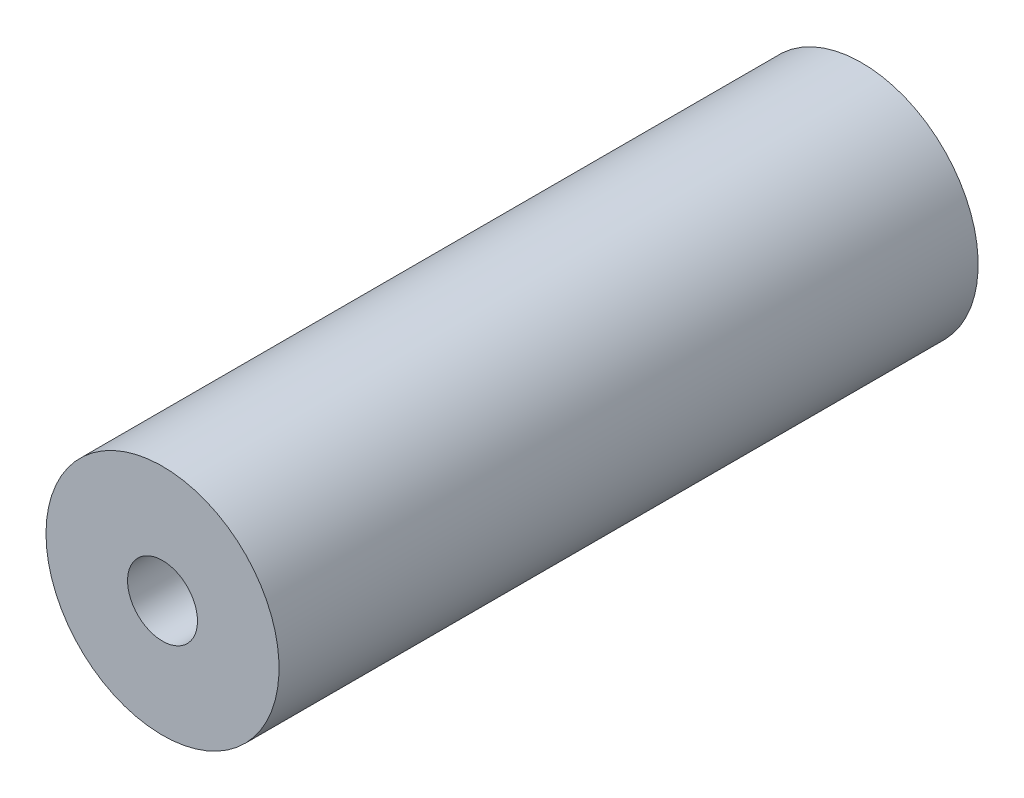
ISO-10303-21;
HEADER;
FILE_DESCRIPTION(('STEP AP214'),'2;1');
FILE_NAME('part.step','',(''),(''),'','','');
FILE_SCHEMA(('AUTOMOTIVE_DESIGN { 1 0 10303 214 1 1 1 1 }'));
ENDSEC;
DATA;
#1=APPLICATION_CONTEXT('core data for automotive mechanical design processes');
#2=APPLICATION_PROTOCOL_DEFINITION('international standard','automotive_design',2000,#1);
#3=PRODUCT_CONTEXT('',#1,'mechanical');
#4=PRODUCT('Part','Part','',(#3));
#5=PRODUCT_RELATED_PRODUCT_CATEGORY('part','',(#4));
#6=PRODUCT_DEFINITION_FORMATION('','',#4);
#7=PRODUCT_DEFINITION_CONTEXT('part definition',#1,'design');
#8=PRODUCT_DEFINITION('design','',#6,#7);
#9=PRODUCT_DEFINITION_SHAPE('','',#8);
#10=(LENGTH_UNIT() NAMED_UNIT(*) SI_UNIT(.MILLI.,.METRE.));
#11=(NAMED_UNIT(*) PLANE_ANGLE_UNIT() SI_UNIT($,.RADIAN.));
#12=(NAMED_UNIT(*) SI_UNIT($,.STERADIAN.) SOLID_ANGLE_UNIT());
#13=UNCERTAINTY_MEASURE_WITH_UNIT(LENGTH_MEASURE(1.E-05),#10,'distance_accuracy_value','');
#14=(GEOMETRIC_REPRESENTATION_CONTEXT(3) GLOBAL_UNCERTAINTY_ASSIGNED_CONTEXT((#13)) GLOBAL_UNIT_ASSIGNED_CONTEXT((#10,
#11,#12)) REPRESENTATION_CONTEXT('',''));
#15=CARTESIAN_POINT('',(0.,0.,0.));
#16=DIRECTION('',(0.,0.,1.));
#17=DIRECTION('',(1.,0.,0.));
#18=AXIS2_PLACEMENT_3D('',#15,#16,#17);
#19=CARTESIAN_POINT('',(0.,0.,21.));
#20=DIRECTION('',(0.,0.,-1.));
#21=DIRECTION('',(-1.,0.,0.));
#22=AXIS2_PLACEMENT_3D('',#19,#20,#21);
#23=CYLINDRICAL_SURFACE('',#22,3.5);
#24=CARTESIAN_POINT('',(0.,0.,21.));
#25=DIRECTION('',(0.,0.,1.));
#26=DIRECTION('',(1.,0.,0.));
#27=AXIS2_PLACEMENT_3D('',#24,#25,#26);
#28=CIRCLE('',#27,3.5);
#29=CARTESIAN_POINT('',(-3.5,0.,21.));
#30=VERTEX_POINT('',#29);
#31=EDGE_CURVE('E11',#30,#30,#28,.T.);
#32=CARTESIAN_POINT('',(0.,0.,0.));
#33=DIRECTION('',(0.,0.,1.));
#34=DIRECTION('',(1.,0.,0.));
#35=AXIS2_PLACEMENT_3D('',#32,#33,#34);
#36=CIRCLE('',#35,3.5);
#37=CARTESIAN_POINT('',(-3.5,0.,0.));
#38=VERTEX_POINT('',#37);
#39=EDGE_CURVE('E44',#38,#38,#36,.T.);
#40=CARTESIAN_POINT('',(-3.5,0.,21.));
#41=CARTESIAN_POINT('',(-3.5,0.,20.78125));
#42=CARTESIAN_POINT('',(-3.5,0.,20.5625));
#43=CARTESIAN_POINT('',(-3.5,0.,20.125));
#44=CARTESIAN_POINT('',(-3.5,0.,19.90625));
#45=CARTESIAN_POINT('',(-3.5,0.,19.46875));
#46=CARTESIAN_POINT('',(-3.5,0.,19.25));
#47=CARTESIAN_POINT('',(-3.5,0.,18.8125));
#48=CARTESIAN_POINT('',(-3.5,0.,18.59375));
#49=CARTESIAN_POINT('',(-3.5,0.,18.15625));
#50=CARTESIAN_POINT('',(-3.5,0.,17.9375));
#51=CARTESIAN_POINT('',(-3.5,0.,17.5));
#52=CARTESIAN_POINT('',(-3.5,0.,17.28125));
#53=CARTESIAN_POINT('',(-3.5,0.,16.84375));
#54=CARTESIAN_POINT('',(-3.5,0.,16.625));
#55=CARTESIAN_POINT('',(-3.5,0.,16.1875));
#56=CARTESIAN_POINT('',(-3.5,0.,15.96875));
#57=CARTESIAN_POINT('',(-3.5,0.,15.53125));
#58=CARTESIAN_POINT('',(-3.5,0.,15.3125));
#59=CARTESIAN_POINT('',(-3.5,0.,14.875));
#60=CARTESIAN_POINT('',(-3.5,0.,14.65625));
#61=CARTESIAN_POINT('',(-3.5,0.,14.21875));
#62=CARTESIAN_POINT('',(-3.5,0.,14.));
#63=CARTESIAN_POINT('',(-3.5,0.,13.5625));
#64=CARTESIAN_POINT('',(-3.5,0.,13.34375));
#65=CARTESIAN_POINT('',(-3.5,0.,12.90625));
#66=CARTESIAN_POINT('',(-3.5,0.,12.6875));
#67=CARTESIAN_POINT('',(-3.5,0.,12.25));
#68=CARTESIAN_POINT('',(-3.5,0.,12.03125));
#69=CARTESIAN_POINT('',(-3.5,0.,11.59375));
#70=CARTESIAN_POINT('',(-3.5,0.,11.375));
#71=CARTESIAN_POINT('',(-3.5,0.,10.9375));
#72=CARTESIAN_POINT('',(-3.5,0.,10.71875));
#73=CARTESIAN_POINT('',(-3.5,0.,10.28125));
#74=CARTESIAN_POINT('',(-3.5,0.,10.0625));
#75=CARTESIAN_POINT('',(-3.5,0.,9.625));
#76=CARTESIAN_POINT('',(-3.5,0.,9.40625));
#77=CARTESIAN_POINT('',(-3.5,0.,8.96875));
#78=CARTESIAN_POINT('',(-3.5,0.,8.75));
#79=CARTESIAN_POINT('',(-3.5,0.,8.3125));
#80=CARTESIAN_POINT('',(-3.5,0.,8.09375));
#81=CARTESIAN_POINT('',(-3.5,0.,7.65625));
#82=CARTESIAN_POINT('',(-3.5,0.,7.4375));
#83=CARTESIAN_POINT('',(-3.5,0.,7.));
#84=CARTESIAN_POINT('',(-3.5,0.,6.78125));
#85=CARTESIAN_POINT('',(-3.5,0.,6.34375));
#86=CARTESIAN_POINT('',(-3.5,0.,6.125));
#87=CARTESIAN_POINT('',(-3.5,0.,5.6875));
#88=CARTESIAN_POINT('',(-3.5,0.,5.46875));
#89=CARTESIAN_POINT('',(-3.5,0.,5.03125));
#90=CARTESIAN_POINT('',(-3.5,0.,4.8125));
#91=CARTESIAN_POINT('',(-3.5,0.,4.375));
#92=CARTESIAN_POINT('',(-3.5,0.,4.15625));
#93=CARTESIAN_POINT('',(-3.5,0.,3.71875));
#94=CARTESIAN_POINT('',(-3.5,0.,3.5));
#95=CARTESIAN_POINT('',(-3.5,0.,3.0625));
#96=CARTESIAN_POINT('',(-3.5,0.,2.84375));
#97=CARTESIAN_POINT('',(-3.5,0.,2.40625));
#98=CARTESIAN_POINT('',(-3.5,0.,2.1875));
#99=CARTESIAN_POINT('',(-3.5,0.,1.75));
#100=CARTESIAN_POINT('',(-3.5,0.,1.53125));
#101=CARTESIAN_POINT('',(-3.5,0.,1.09375));
#102=CARTESIAN_POINT('',(-3.5,0.,0.875000000000001));
#103=CARTESIAN_POINT('',(-3.5,0.,0.4375));
#104=CARTESIAN_POINT('',(-3.5,0.,0.21875));
#105=CARTESIAN_POINT('',(-3.5,0.,0.));
#106=B_SPLINE_CURVE_WITH_KNOTS('',3,(#40,#41,#42,#43,#44,#45,#46,#47,#48,#49,#50,#51,#52,#53,
#54,#55,#56,#57,#58,#59,#60,#61,#62,#63,#64,#65,#66,#67,#68,#69,#70,#71,#72,#73,#74,#75,#76,#77,
#78,#79,#80,#81,#82,#83,#84,#85,#86,#87,#88,#89,#90,#91,#92,#93,#94,#95,#96,#97,#98,#99,#100,
#101,#102,#103,#104,#105),.UNSPECIFIED.,.F.,.F.,(4,2,2,2,2,2,2,2,2,2,2,2,2,2,2,2,2,2,2,2,2,2,2,
2,2,2,2,2,2,2,2,2,4),(0.,0.656249999999997,1.3125,1.96875,2.625,3.28125,3.9375,4.59375,5.25,
5.90625,6.5625,7.21875,7.875,8.53125,9.1875,9.84375,10.5,11.15625,11.8125,12.46875,13.125,
13.78125,14.4375,15.09375,15.75,16.40625,17.0625,17.71875,18.375,19.03125,19.6875,20.34375,21.),.UNSPECIFIED.);
#107=EDGE_CURVE('BSEAM41',#30,#38,#106,.T.);
#108=ORIENTED_EDGE('',*,*,#31,.F.);
#109=ORIENTED_EDGE('',*,*,#39,.T.);
#110=ORIENTED_EDGE('',*,*,#107,.T.);
#111=ORIENTED_EDGE('',*,*,#107,.F.);
#112=EDGE_LOOP('',(#108,#110,#109,#111));
#113=FACE_BOUND('',#112,.T.);
#114=ADVANCED_FACE('F41',(#113),#23,.T.);
#115=CARTESIAN_POINT('',(0.,0.,21.));
#116=DIRECTION('',(0.,0.,1.));
#117=DIRECTION('',(1.,0.,0.));
#118=AXIS2_PLACEMENT_3D('',#115,#116,#117);
#119=PLANE('',#118);
#120=CARTESIAN_POINT('',(0.,0.,21.));
#121=DIRECTION('',(0.,0.,1.));
#122=DIRECTION('',(1.,0.,0.));
#123=AXIS2_PLACEMENT_3D('',#120,#121,#122);
#124=CIRCLE('',#123,1.05);
#125=CARTESIAN_POINT('',(1.05,0.,21.));
#126=VERTEX_POINT('',#125);
#127=EDGE_CURVE('E116',#126,#126,#124,.T.);
#128=ORIENTED_EDGE('',*,*,#127,.F.);
#129=EDGE_LOOP('',(#128));
#130=FACE_BOUND('',#129,.T.);
#131=ORIENTED_EDGE('',*,*,#31,.T.);
#132=EDGE_LOOP('',(#131));
#133=FACE_BOUND('',#132,.T.);
#134=ADVANCED_FACE('F127',(#130,#133),#119,.T.);
#135=CARTESIAN_POINT('',(0.,0.,0.));
#136=DIRECTION('',(0.,0.,1.));
#137=DIRECTION('',(1.,0.,0.));
#138=AXIS2_PLACEMENT_3D('',#135,#136,#137);
#139=PLANE('',#138);
#140=DIRECTION('',(1.,0.,0.));
#141=VECTOR('',#140,1.);
#142=CARTESIAN_POINT('',(2.325,2.325,0.));
#143=LINE('',#142,#141);
#144=CARTESIAN_POINT('',(-2.325,2.325,0.));
#145=VERTEX_POINT('',#144);
#146=CARTESIAN_POINT('',(2.325,2.325,0.));
#147=VERTEX_POINT('',#146);
#148=EDGE_CURVE('E90',#145,#147,#143,.T.);
#149=ORIENTED_EDGE('',*,*,#148,.F.);
#150=DIRECTION('',(0.,1.,0.));
#151=VECTOR('',#150,1.);
#152=CARTESIAN_POINT('',(-2.325,2.325,0.));
#153=LINE('',#152,#151);
#154=CARTESIAN_POINT('',(-2.325,-2.325,0.));
#155=VERTEX_POINT('',#154);
#156=EDGE_CURVE('E55',#155,#145,#153,.T.);
#157=ORIENTED_EDGE('',*,*,#156,.F.);
#158=DIRECTION('',(-1.,0.,0.));
#159=VECTOR('',#158,1.);
#160=CARTESIAN_POINT('',(2.325,-2.325,0.));
#161=LINE('',#160,#159);
#162=CARTESIAN_POINT('',(2.325,-2.325,0.));
#163=VERTEX_POINT('',#162);
#164=EDGE_CURVE('E106',#163,#155,#161,.T.);
#165=ORIENTED_EDGE('',*,*,#164,.F.);
#166=DIRECTION('',(0.,-1.,0.));
#167=VECTOR('',#166,1.);
#168=CARTESIAN_POINT('',(2.325,2.325,0.));
#169=LINE('',#168,#167);
#170=EDGE_CURVE('E112',#147,#163,#169,.T.);
#171=ORIENTED_EDGE('',*,*,#170,.F.);
#172=EDGE_LOOP('',(#149,#157,#165,#171));
#173=FACE_BOUND('',#172,.T.);
#174=ORIENTED_EDGE('',*,*,#39,.F.);
#175=EDGE_LOOP('',(#174));
#176=FACE_BOUND('',#175,.T.);
#177=ADVANCED_FACE('F130',(#173,#176),#139,.F.);
#178=CARTESIAN_POINT('',(0.,0.,15.));
#179=DIRECTION('',(0.,0.,1.));
#180=DIRECTION('',(1.,0.,0.));
#181=AXIS2_PLACEMENT_3D('',#178,#179,#180);
#182=CYLINDRICAL_SURFACE('',#181,1.05);
#183=CARTESIAN_POINT('',(0.,0.,15.));
#184=DIRECTION('',(0.,0.,1.));
#185=DIRECTION('',(1.,0.,0.));
#186=AXIS2_PLACEMENT_3D('',#183,#184,#185);
#187=CIRCLE('',#186,1.05);
#188=CARTESIAN_POINT('',(1.05,0.,15.));
#189=VERTEX_POINT('',#188);
#190=EDGE_CURVE('E119',#189,#189,#187,.T.);
#191=ORIENTED_EDGE('',*,*,#190,.F.);
#192=EDGE_LOOP('',(#191));
#193=FACE_BOUND('',#192,.T.);
#194=ORIENTED_EDGE('',*,*,#127,.T.);
#195=EDGE_LOOP('',(#194));
#196=FACE_BOUND('',#195,.T.);
#197=ADVANCED_FACE('F125',(#193,#196),#182,.F.);
#198=CARTESIAN_POINT('',(0.,0.,15.));
#199=DIRECTION('',(0.,0.,1.));
#200=DIRECTION('',(1.,0.,0.));
#201=AXIS2_PLACEMENT_3D('',#198,#199,#200);
#202=PLANE('',#201);
#203=ORIENTED_EDGE('',*,*,#190,.T.);
#204=EDGE_LOOP('',(#203));
#205=FACE_BOUND('',#204,.T.);
#206=ADVANCED_FACE('F146',(#205),#202,.T.);
#207=CARTESIAN_POINT('',(-2.325,2.325,10.2));
#208=DIRECTION('',(-1.,0.,0.));
#209=DIRECTION('',(0.,-1.,0.));
#210=AXIS2_PLACEMENT_3D('',#207,#208,#209);
#211=PLANE('',#210);
#212=ORIENTED_EDGE('',*,*,#156,.T.);
#213=DIRECTION('',(0.,0.,-1.));
#214=VECTOR('',#213,1.);
#215=CARTESIAN_POINT('',(-2.325,2.325,10.2));
#216=LINE('',#215,#214);
#217=CARTESIAN_POINT('',(-2.325,2.325,10.2));
#218=VERTEX_POINT('',#217);
#219=EDGE_CURVE('E78',#218,#145,#216,.T.);
#220=ORIENTED_EDGE('',*,*,#219,.F.);
#221=DIRECTION('',(0.,1.,0.));
#222=VECTOR('',#221,1.);
#223=CARTESIAN_POINT('',(-2.325,2.325,10.2));
#224=LINE('',#223,#222);
#225=CARTESIAN_POINT('',(-2.325,-2.325,10.2));
#226=VERTEX_POINT('',#225);
#227=EDGE_CURVE('E104',#226,#218,#224,.T.);
#228=ORIENTED_EDGE('',*,*,#227,.F.);
#229=DIRECTION('',(0.,0.,-1.));
#230=VECTOR('',#229,1.);
#231=CARTESIAN_POINT('',(-2.325,-2.325,10.2));
#232=LINE('',#231,#230);
#233=EDGE_CURVE('E63',#226,#155,#232,.T.);
#234=ORIENTED_EDGE('',*,*,#233,.T.);
#235=EDGE_LOOP('',(#212,#220,#228,#234));
#236=FACE_BOUND('',#235,.T.);
#237=ADVANCED_FACE('F151',(#236),#211,.F.);
#238=CARTESIAN_POINT('',(2.325,-2.325,10.2));
#239=DIRECTION('',(0.,-1.,0.));
#240=DIRECTION('',(0.,0.,-1.));
#241=AXIS2_PLACEMENT_3D('',#238,#239,#240);
#242=PLANE('',#241);
#243=ORIENTED_EDGE('',*,*,#164,.T.);
#244=ORIENTED_EDGE('',*,*,#233,.F.);
#245=DIRECTION('',(-1.,0.,0.));
#246=VECTOR('',#245,1.);
#247=CARTESIAN_POINT('',(2.325,-2.325,10.2));
#248=LINE('',#247,#246);
#249=CARTESIAN_POINT('',(2.325,-2.325,10.2));
#250=VERTEX_POINT('',#249);
#251=EDGE_CURVE('E101',#250,#226,#248,.T.);
#252=ORIENTED_EDGE('',*,*,#251,.F.);
#253=DIRECTION('',(0.,0.,-1.));
#254=VECTOR('',#253,1.);
#255=CARTESIAN_POINT('',(2.325,-2.325,10.2));
#256=LINE('',#255,#254);
#257=EDGE_CURVE('E94',#250,#163,#256,.T.);
#258=ORIENTED_EDGE('',*,*,#257,.T.);
#259=EDGE_LOOP('',(#243,#244,#252,#258));
#260=FACE_BOUND('',#259,.T.);
#261=ADVANCED_FACE('F154',(#260),#242,.F.);
#262=CARTESIAN_POINT('',(2.325,2.325,10.2));
#263=DIRECTION('',(1.,0.,0.));
#264=DIRECTION('',(0.,1.,0.));
#265=AXIS2_PLACEMENT_3D('',#262,#263,#264);
#266=PLANE('',#265);
#267=ORIENTED_EDGE('',*,*,#170,.T.);
#268=ORIENTED_EDGE('',*,*,#257,.F.);
#269=DIRECTION('',(0.,-1.,0.));
#270=VECTOR('',#269,1.);
#271=CARTESIAN_POINT('',(2.325,2.325,10.2));
#272=LINE('',#271,#270);
#273=CARTESIAN_POINT('',(2.325,2.325,10.2));
#274=VERTEX_POINT('',#273);
#275=EDGE_CURVE('E97',#274,#250,#272,.T.);
#276=ORIENTED_EDGE('',*,*,#275,.F.);
#277=DIRECTION('',(0.,0.,-1.));
#278=VECTOR('',#277,1.);
#279=CARTESIAN_POINT('',(2.325,2.325,10.2));
#280=LINE('',#279,#278);
#281=EDGE_CURVE('E83',#274,#147,#280,.T.);
#282=ORIENTED_EDGE('',*,*,#281,.T.);
#283=EDGE_LOOP('',(#267,#268,#276,#282));
#284=FACE_BOUND('',#283,.T.);
#285=ADVANCED_FACE('F98',(#284),#266,.F.);
#286=CARTESIAN_POINT('',(2.325,2.325,10.2));
#287=DIRECTION('',(0.,1.,0.));
#288=DIRECTION('',(0.,0.,1.));
#289=AXIS2_PLACEMENT_3D('',#286,#287,#288);
#290=PLANE('',#289);
#291=ORIENTED_EDGE('',*,*,#148,.T.);
#292=ORIENTED_EDGE('',*,*,#281,.F.);
#293=DIRECTION('',(1.,0.,0.));
#294=VECTOR('',#293,1.);
#295=CARTESIAN_POINT('',(2.325,2.325,10.2));
#296=LINE('',#295,#294);
#297=EDGE_CURVE('E87',#218,#274,#296,.T.);
#298=ORIENTED_EDGE('',*,*,#297,.F.);
#299=ORIENTED_EDGE('',*,*,#219,.T.);
#300=EDGE_LOOP('',(#291,#292,#298,#299));
#301=FACE_BOUND('',#300,.T.);
#302=ADVANCED_FACE('F85',(#301),#290,.F.);
#303=CARTESIAN_POINT('',(0.,0.,10.2));
#304=DIRECTION('',(0.,0.,-1.));
#305=DIRECTION('',(-1.,0.,0.));
#306=AXIS2_PLACEMENT_3D('',#303,#304,#305);
#307=PLANE('',#306);
#308=ORIENTED_EDGE('',*,*,#227,.T.);
#309=ORIENTED_EDGE('',*,*,#297,.T.);
#310=ORIENTED_EDGE('',*,*,#275,.T.);
#311=ORIENTED_EDGE('',*,*,#251,.T.);
#312=EDGE_LOOP('',(#308,#309,#310,#311));
#313=FACE_BOUND('',#312,.T.);
#314=ADVANCED_FACE('F103',(#313),#307,.T.);
#315=CLOSED_SHELL('',(#114,#134,#177,#197,#206,#237,#261,#285,#302,#314));
#316=MANIFOLD_SOLID_BREP('B2',#315);
#317=ADVANCED_BREP_SHAPE_REPRESENTATION('',(#18,#316),#14);
#318=SHAPE_DEFINITION_REPRESENTATION(#9,#317);
ENDSEC;
END-ISO-10303-21;
